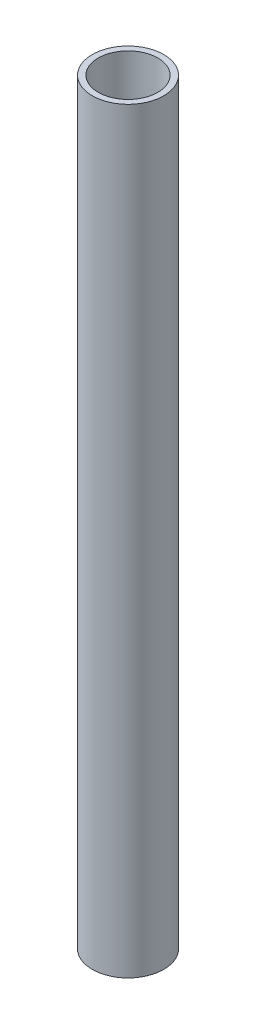
ISO-10303-21;
HEADER;
FILE_DESCRIPTION(('STEP AP214'),'2;1');
FILE_NAME('part.step','',(''),(''),'','','');
FILE_SCHEMA(('AUTOMOTIVE_DESIGN { 1 0 10303 214 1 1 1 1 }'));
ENDSEC;
DATA;
#1=APPLICATION_CONTEXT('core data for automotive mechanical design processes');
#2=APPLICATION_PROTOCOL_DEFINITION('international standard','automotive_design',2000,#1);
#3=PRODUCT_CONTEXT('',#1,'mechanical');
#4=PRODUCT('Part','Part','',(#3));
#5=PRODUCT_RELATED_PRODUCT_CATEGORY('part','',(#4));
#6=PRODUCT_DEFINITION_FORMATION('','',#4);
#7=PRODUCT_DEFINITION_CONTEXT('part definition',#1,'design');
#8=PRODUCT_DEFINITION('design','',#6,#7);
#9=PRODUCT_DEFINITION_SHAPE('','',#8);
#10=(LENGTH_UNIT() NAMED_UNIT(*) SI_UNIT(.MILLI.,.METRE.));
#11=(NAMED_UNIT(*) PLANE_ANGLE_UNIT() SI_UNIT($,.RADIAN.));
#12=(NAMED_UNIT(*) SI_UNIT($,.STERADIAN.) SOLID_ANGLE_UNIT());
#13=UNCERTAINTY_MEASURE_WITH_UNIT(LENGTH_MEASURE(1.E-05),#10,'distance_accuracy_value','');
#14=(GEOMETRIC_REPRESENTATION_CONTEXT(3) GLOBAL_UNCERTAINTY_ASSIGNED_CONTEXT((#13)) GLOBAL_UNIT_ASSIGNED_CONTEXT((#10,
#11,#12)) REPRESENTATION_CONTEXT('',''));
#15=CARTESIAN_POINT('',(0.,0.,0.));
#16=DIRECTION('',(0.,0.,1.));
#17=DIRECTION('',(1.,0.,0.));
#18=AXIS2_PLACEMENT_3D('',#15,#16,#17);
#19=CARTESIAN_POINT('',(0.,127.,0.));
#20=DIRECTION('',(0.,1.,0.));
#21=DIRECTION('',(0.,0.,-1.));
#22=AXIS2_PLACEMENT_3D('',#19,#20,#21);
#23=PLANE('',#22);
#24=CARTESIAN_POINT('',(0.,127.,0.));
#25=DIRECTION('',(0.,-1.,0.));
#26=DIRECTION('',(0.,0.,-1.));
#27=AXIS2_PLACEMENT_3D('',#24,#25,#26);
#28=CIRCLE('',#27,6.);
#29=CARTESIAN_POINT('',(0.,127.,-6.));
#30=VERTEX_POINT('',#29);
#31=EDGE_CURVE('E10',#30,#30,#28,.T.);
#32=ORIENTED_EDGE('',*,*,#31,.F.);
#33=EDGE_LOOP('',(#32));
#34=FACE_BOUND('',#33,.T.);
#35=CARTESIAN_POINT('',(0.,127.,0.));
#36=DIRECTION('',(0.,-1.,0.));
#37=DIRECTION('',(0.,0.,-1.));
#38=AXIS2_PLACEMENT_3D('',#35,#36,#37);
#39=CIRCLE('',#38,5.);
#40=CARTESIAN_POINT('',(0.,127.,-5.));
#41=VERTEX_POINT('',#40);
#42=EDGE_CURVE('E44',#41,#41,#39,.T.);
#43=ORIENTED_EDGE('',*,*,#42,.T.);
#44=EDGE_LOOP('',(#43));
#45=FACE_BOUND('',#44,.T.);
#46=ADVANCED_FACE('F33',(#34,#45),#23,.T.);
#47=CARTESIAN_POINT('',(0.,0.,0.));
#48=DIRECTION('',(0.,1.,0.));
#49=DIRECTION('',(0.,0.,-1.));
#50=AXIS2_PLACEMENT_3D('',#47,#48,#49);
#51=PLANE('',#50);
#52=CARTESIAN_POINT('',(0.,0.,0.));
#53=DIRECTION('',(0.,-1.,0.));
#54=DIRECTION('',(0.,0.,-1.));
#55=AXIS2_PLACEMENT_3D('',#52,#53,#54);
#56=CIRCLE('',#55,6.);
#57=CARTESIAN_POINT('',(0.,0.,-6.));
#58=VERTEX_POINT('',#57);
#59=EDGE_CURVE('E37',#58,#58,#56,.T.);
#60=ORIENTED_EDGE('',*,*,#59,.T.);
#61=EDGE_LOOP('',(#60));
#62=FACE_BOUND('',#61,.T.);
#63=CARTESIAN_POINT('',(0.,0.,0.));
#64=DIRECTION('',(0.,-1.,0.));
#65=DIRECTION('',(0.,0.,-1.));
#66=AXIS2_PLACEMENT_3D('',#63,#64,#65);
#67=CIRCLE('',#66,5.);
#68=CARTESIAN_POINT('',(0.,0.,-5.));
#69=VERTEX_POINT('',#68);
#70=EDGE_CURVE('E46',#69,#69,#67,.T.);
#71=ORIENTED_EDGE('',*,*,#70,.F.);
#72=EDGE_LOOP('',(#71));
#73=FACE_BOUND('',#72,.T.);
#74=ADVANCED_FACE('F59',(#62,#73),#51,.F.);
#75=CARTESIAN_POINT('',(0.,127.,0.));
#76=DIRECTION('',(0.,-1.,0.));
#77=DIRECTION('',(0.,0.,1.));
#78=AXIS2_PLACEMENT_3D('',#75,#76,#77);
#79=CYLINDRICAL_SURFACE('',#78,6.);
#80=ORIENTED_EDGE('',*,*,#31,.T.);
#81=EDGE_LOOP('',(#80));
#82=FACE_BOUND('',#81,.T.);
#83=ORIENTED_EDGE('',*,*,#59,.F.);
#84=EDGE_LOOP('',(#83));
#85=FACE_BOUND('',#84,.T.);
#86=ADVANCED_FACE('F35',(#82,#85),#79,.T.);
#87=CARTESIAN_POINT('',(0.,127.,0.));
#88=DIRECTION('',(0.,-1.,0.));
#89=DIRECTION('',(0.,0.,1.));
#90=AXIS2_PLACEMENT_3D('',#87,#88,#89);
#91=CYLINDRICAL_SURFACE('',#90,5.);
#92=ORIENTED_EDGE('',*,*,#42,.F.);
#93=EDGE_LOOP('',(#92));
#94=FACE_BOUND('',#93,.T.);
#95=ORIENTED_EDGE('',*,*,#70,.T.);
#96=EDGE_LOOP('',(#95));
#97=FACE_BOUND('',#96,.T.);
#98=ADVANCED_FACE('F53',(#94,#97),#91,.F.);
#99=CLOSED_SHELL('',(#46,#74,#86,#98));
#100=MANIFOLD_SOLID_BREP('B2',#99);
#101=ADVANCED_BREP_SHAPE_REPRESENTATION('',(#18,#100),#14);
#102=SHAPE_DEFINITION_REPRESENTATION(#9,#101);
ENDSEC;
END-ISO-10303-21;
